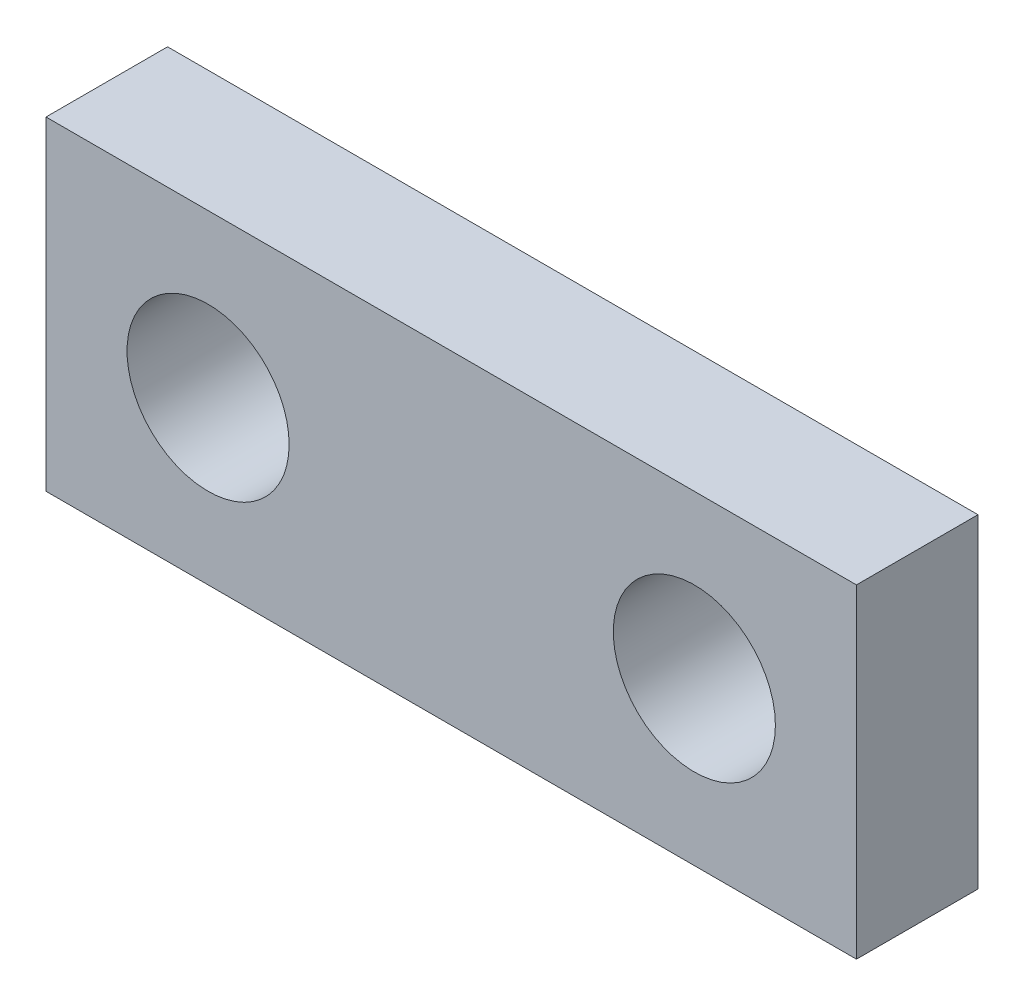
ISO-10303-21;
HEADER;
FILE_DESCRIPTION(('STEP AP214'),'2;1');
FILE_NAME('part.step','',(''),(''),'','','');
FILE_SCHEMA(('AUTOMOTIVE_DESIGN { 1 0 10303 214 1 1 1 1 }'));
ENDSEC;
DATA;
#1=APPLICATION_CONTEXT('core data for automotive mechanical design processes');
#2=APPLICATION_PROTOCOL_DEFINITION('international standard','automotive_design',2000,#1);
#3=PRODUCT_CONTEXT('',#1,'mechanical');
#4=PRODUCT('Part','Part','',(#3));
#5=PRODUCT_RELATED_PRODUCT_CATEGORY('part','',(#4));
#6=PRODUCT_DEFINITION_FORMATION('','',#4);
#7=PRODUCT_DEFINITION_CONTEXT('part definition',#1,'design');
#8=PRODUCT_DEFINITION('design','',#6,#7);
#9=PRODUCT_DEFINITION_SHAPE('','',#8);
#10=(LENGTH_UNIT() NAMED_UNIT(*) SI_UNIT(.MILLI.,.METRE.));
#11=(NAMED_UNIT(*) PLANE_ANGLE_UNIT() SI_UNIT($,.RADIAN.));
#12=(NAMED_UNIT(*) SI_UNIT($,.STERADIAN.) SOLID_ANGLE_UNIT());
#13=UNCERTAINTY_MEASURE_WITH_UNIT(LENGTH_MEASURE(1.E-05),#10,'distance_accuracy_value','');
#14=(GEOMETRIC_REPRESENTATION_CONTEXT(3) GLOBAL_UNCERTAINTY_ASSIGNED_CONTEXT((#13)) GLOBAL_UNIT_ASSIGNED_CONTEXT((#10,
#11,#12)) REPRESENTATION_CONTEXT('',''));
#15=CARTESIAN_POINT('',(0.,0.,0.));
#16=DIRECTION('',(0.,0.,1.));
#17=DIRECTION('',(1.,0.,0.));
#18=AXIS2_PLACEMENT_3D('',#15,#16,#17);
#19=CARTESIAN_POINT('',(0.,0.,3.));
#20=DIRECTION('',(0.,0.,-1.));
#21=DIRECTION('',(-1.,0.,0.));
#22=AXIS2_PLACEMENT_3D('',#19,#20,#21);
#23=PLANE('',#22);
#24=DIRECTION('',(0.,1.,0.));
#25=VECTOR('',#24,1.);
#26=CARTESIAN_POINT('',(10.,4.,3.));
#27=LINE('',#26,#25);
#28=CARTESIAN_POINT('',(10.,-4.,3.));
#29=VERTEX_POINT('',#28);
#30=CARTESIAN_POINT('',(10.,4.,3.));
#31=VERTEX_POINT('',#30);
#32=EDGE_CURVE('E92',#29,#31,#27,.T.);
#33=ORIENTED_EDGE('',*,*,#32,.T.);
#34=DIRECTION('',(-1.,0.,0.));
#35=VECTOR('',#34,1.);
#36=CARTESIAN_POINT('',(10.,4.,3.));
#37=LINE('',#36,#35);
#38=CARTESIAN_POINT('',(-10.,4.,3.));
#39=VERTEX_POINT('',#38);
#40=EDGE_CURVE('E87',#31,#39,#37,.T.);
#41=ORIENTED_EDGE('',*,*,#40,.T.);
#42=DIRECTION('',(0.,-1.,0.));
#43=VECTOR('',#42,1.);
#44=CARTESIAN_POINT('',(-10.,-4.,3.));
#45=LINE('',#44,#43);
#46=CARTESIAN_POINT('',(-10.,-4.,3.));
#47=VERTEX_POINT('',#46);
#48=EDGE_CURVE('E90',#39,#47,#45,.T.);
#49=ORIENTED_EDGE('',*,*,#48,.T.);
#50=DIRECTION('',(1.,0.,0.));
#51=VECTOR('',#50,1.);
#52=CARTESIAN_POINT('',(10.,-4.,3.));
#53=LINE('',#52,#51);
#54=EDGE_CURVE('E57',#47,#29,#53,.T.);
#55=ORIENTED_EDGE('',*,*,#54,.T.);
#56=EDGE_LOOP('',(#33,#41,#49,#55));
#57=FACE_BOUND('',#56,.T.);
#58=CARTESIAN_POINT('',(6.,0.,3.));
#59=DIRECTION('',(0.,0.,1.));
#60=DIRECTION('',(1.,0.,0.));
#61=AXIS2_PLACEMENT_3D('',#58,#59,#60);
#62=CIRCLE('',#61,2.);
#63=CARTESIAN_POINT('',(8.,0.,3.));
#64=VERTEX_POINT('',#63);
#65=EDGE_CURVE('E112',#64,#64,#62,.T.);
#66=ORIENTED_EDGE('',*,*,#65,.F.);
#67=EDGE_LOOP('',(#66));
#68=FACE_BOUND('',#67,.T.);
#69=CARTESIAN_POINT('',(-6.,0.,3.));
#70=DIRECTION('',(0.,0.,1.));
#71=DIRECTION('',(1.,0.,0.));
#72=AXIS2_PLACEMENT_3D('',#69,#70,#71);
#73=CIRCLE('',#72,2.);
#74=CARTESIAN_POINT('',(-4.,0.,3.));
#75=VERTEX_POINT('',#74);
#76=EDGE_CURVE('E134',#75,#75,#73,.T.);
#77=ORIENTED_EDGE('',*,*,#76,.F.);
#78=EDGE_LOOP('',(#77));
#79=FACE_BOUND('',#78,.T.);
#80=ADVANCED_FACE('F39',(#57,#68,#79),#23,.F.);
#81=CARTESIAN_POINT('',(0.,0.,0.));
#82=DIRECTION('',(0.,0.,-1.));
#83=DIRECTION('',(-1.,0.,0.));
#84=AXIS2_PLACEMENT_3D('',#81,#82,#83);
#85=PLANE('',#84);
#86=CARTESIAN_POINT('',(6.,0.,0.));
#87=DIRECTION('',(0.,0.,1.));
#88=DIRECTION('',(1.,0.,0.));
#89=AXIS2_PLACEMENT_3D('',#86,#87,#88);
#90=CIRCLE('',#89,2.);
#91=CARTESIAN_POINT('',(8.,0.,0.));
#92=VERTEX_POINT('',#91);
#93=EDGE_CURVE('E130',#92,#92,#90,.T.);
#94=ORIENTED_EDGE('',*,*,#93,.T.);
#95=EDGE_LOOP('',(#94));
#96=FACE_BOUND('',#95,.T.);
#97=DIRECTION('',(0.,1.,0.));
#98=VECTOR('',#97,1.);
#99=CARTESIAN_POINT('',(10.,4.,0.));
#100=LINE('',#99,#98);
#101=CARTESIAN_POINT('',(10.,-4.,0.));
#102=VERTEX_POINT('',#101);
#103=CARTESIAN_POINT('',(10.,4.,0.));
#104=VERTEX_POINT('',#103);
#105=EDGE_CURVE('E108',#102,#104,#100,.T.);
#106=ORIENTED_EDGE('',*,*,#105,.F.);
#107=DIRECTION('',(1.,0.,0.));
#108=VECTOR('',#107,1.);
#109=CARTESIAN_POINT('',(10.,-4.,0.));
#110=LINE('',#109,#108);
#111=CARTESIAN_POINT('',(-10.,-4.,0.));
#112=VERTEX_POINT('',#111);
#113=EDGE_CURVE('E80',#112,#102,#110,.T.);
#114=ORIENTED_EDGE('',*,*,#113,.F.);
#115=DIRECTION('',(0.,-1.,0.));
#116=VECTOR('',#115,1.);
#117=CARTESIAN_POINT('',(-10.,-4.,0.));
#118=LINE('',#117,#116);
#119=CARTESIAN_POINT('',(-10.,4.,0.));
#120=VERTEX_POINT('',#119);
#121=EDGE_CURVE('E74',#120,#112,#118,.T.);
#122=ORIENTED_EDGE('',*,*,#121,.F.);
#123=DIRECTION('',(-1.,0.,0.));
#124=VECTOR('',#123,1.);
#125=CARTESIAN_POINT('',(10.,4.,0.));
#126=LINE('',#125,#124);
#127=EDGE_CURVE('E97',#104,#120,#126,.T.);
#128=ORIENTED_EDGE('',*,*,#127,.F.);
#129=EDGE_LOOP('',(#106,#114,#122,#128));
#130=FACE_BOUND('',#129,.T.);
#131=CARTESIAN_POINT('',(-6.,0.,0.));
#132=DIRECTION('',(0.,0.,1.));
#133=DIRECTION('',(1.,0.,0.));
#134=AXIS2_PLACEMENT_3D('',#131,#132,#133);
#135=CIRCLE('',#134,2.);
#136=CARTESIAN_POINT('',(-4.,0.,0.));
#137=VERTEX_POINT('',#136);
#138=EDGE_CURVE('E138',#137,#137,#135,.T.);
#139=ORIENTED_EDGE('',*,*,#138,.T.);
#140=EDGE_LOOP('',(#139));
#141=FACE_BOUND('',#140,.T.);
#142=ADVANCED_FACE('F125',(#96,#130,#141),#85,.T.);
#143=CARTESIAN_POINT('',(10.,4.,3.));
#144=DIRECTION('',(-1.,0.,0.));
#145=DIRECTION('',(0.,0.,1.));
#146=AXIS2_PLACEMENT_3D('',#143,#144,#145);
#147=PLANE('',#146);
#148=ORIENTED_EDGE('',*,*,#105,.T.);
#149=DIRECTION('',(0.,0.,-1.));
#150=VECTOR('',#149,1.);
#151=CARTESIAN_POINT('',(10.,4.,3.));
#152=LINE('',#151,#150);
#153=EDGE_CURVE('E11',#31,#104,#152,.T.);
#154=ORIENTED_EDGE('',*,*,#153,.F.);
#155=ORIENTED_EDGE('',*,*,#32,.F.);
#156=DIRECTION('',(0.,0.,-1.));
#157=VECTOR('',#156,1.);
#158=CARTESIAN_POINT('',(10.,-4.,3.));
#159=LINE('',#158,#157);
#160=EDGE_CURVE('E104',#29,#102,#159,.T.);
#161=ORIENTED_EDGE('',*,*,#160,.T.);
#162=EDGE_LOOP('',(#148,#154,#155,#161));
#163=FACE_BOUND('',#162,.T.);
#164=ADVANCED_FACE('F41',(#163),#147,.F.);
#165=CARTESIAN_POINT('',(10.,4.,3.));
#166=DIRECTION('',(0.,-1.,0.));
#167=DIRECTION('',(0.,0.,-1.));
#168=AXIS2_PLACEMENT_3D('',#165,#166,#167);
#169=PLANE('',#168);
#170=ORIENTED_EDGE('',*,*,#127,.T.);
#171=DIRECTION('',(0.,0.,-1.));
#172=VECTOR('',#171,1.);
#173=CARTESIAN_POINT('',(-10.,4.,3.));
#174=LINE('',#173,#172);
#175=EDGE_CURVE('E49',#39,#120,#174,.T.);
#176=ORIENTED_EDGE('',*,*,#175,.F.);
#177=ORIENTED_EDGE('',*,*,#40,.F.);
#178=ORIENTED_EDGE('',*,*,#153,.T.);
#179=EDGE_LOOP('',(#170,#176,#177,#178));
#180=FACE_BOUND('',#179,.T.);
#181=ADVANCED_FACE('F96',(#180),#169,.F.);
#182=CARTESIAN_POINT('',(-10.,-4.,3.));
#183=DIRECTION('',(1.,0.,0.));
#184=DIRECTION('',(0.,0.,-1.));
#185=AXIS2_PLACEMENT_3D('',#182,#183,#184);
#186=PLANE('',#185);
#187=ORIENTED_EDGE('',*,*,#121,.T.);
#188=DIRECTION('',(0.,0.,-1.));
#189=VECTOR('',#188,1.);
#190=CARTESIAN_POINT('',(-10.,-4.,3.));
#191=LINE('',#190,#189);
#192=EDGE_CURVE('E99',#47,#112,#191,.T.);
#193=ORIENTED_EDGE('',*,*,#192,.F.);
#194=ORIENTED_EDGE('',*,*,#48,.F.);
#195=ORIENTED_EDGE('',*,*,#175,.T.);
#196=EDGE_LOOP('',(#187,#193,#194,#195));
#197=FACE_BOUND('',#196,.T.);
#198=ADVANCED_FACE('F100',(#197),#186,.F.);
#199=CARTESIAN_POINT('',(10.,-4.,3.));
#200=DIRECTION('',(0.,1.,0.));
#201=DIRECTION('',(0.,0.,1.));
#202=AXIS2_PLACEMENT_3D('',#199,#200,#201);
#203=PLANE('',#202);
#204=ORIENTED_EDGE('',*,*,#113,.T.);
#205=ORIENTED_EDGE('',*,*,#160,.F.);
#206=ORIENTED_EDGE('',*,*,#54,.F.);
#207=ORIENTED_EDGE('',*,*,#192,.T.);
#208=EDGE_LOOP('',(#204,#205,#206,#207));
#209=FACE_BOUND('',#208,.T.);
#210=ADVANCED_FACE('F122',(#209),#203,.F.);
#211=CARTESIAN_POINT('',(6.,0.,3.));
#212=DIRECTION('',(0.,0.,-1.));
#213=DIRECTION('',(-1.,0.,0.));
#214=AXIS2_PLACEMENT_3D('',#211,#212,#213);
#215=CYLINDRICAL_SURFACE('',#214,2.);
#216=ORIENTED_EDGE('',*,*,#65,.T.);
#217=EDGE_LOOP('',(#216));
#218=FACE_BOUND('',#217,.T.);
#219=ORIENTED_EDGE('',*,*,#93,.F.);
#220=EDGE_LOOP('',(#219));
#221=FACE_BOUND('',#220,.T.);
#222=ADVANCED_FACE('F157',(#218,#221),#215,.F.);
#223=CARTESIAN_POINT('',(-6.,0.,3.));
#224=DIRECTION('',(0.,0.,-1.));
#225=DIRECTION('',(-1.,0.,0.));
#226=AXIS2_PLACEMENT_3D('',#223,#224,#225);
#227=CYLINDRICAL_SURFACE('',#226,2.);
#228=ORIENTED_EDGE('',*,*,#76,.T.);
#229=EDGE_LOOP('',(#228));
#230=FACE_BOUND('',#229,.T.);
#231=ORIENTED_EDGE('',*,*,#138,.F.);
#232=EDGE_LOOP('',(#231));
#233=FACE_BOUND('',#232,.T.);
#234=ADVANCED_FACE('F146',(#230,#233),#227,.F.);
#235=CLOSED_SHELL('',(#80,#142,#164,#181,#198,#210,#222,#234));
#236=MANIFOLD_SOLID_BREP('B2',#235);
#237=ADVANCED_BREP_SHAPE_REPRESENTATION('',(#18,#236),#14);
#238=SHAPE_DEFINITION_REPRESENTATION(#9,#237);
ENDSEC;
END-ISO-10303-21;
